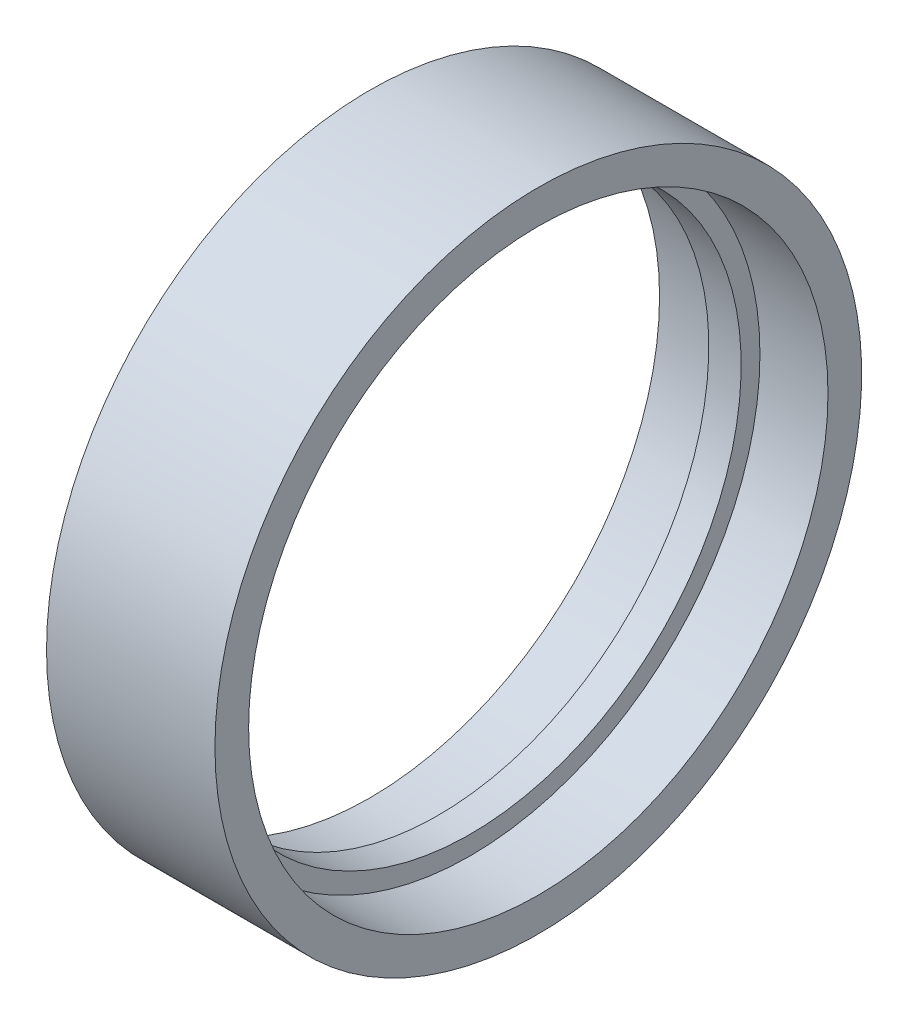
ISO-10303-21;
HEADER;
FILE_DESCRIPTION(('STEP AP214'),'2;1');
FILE_NAME('part.step','',(''),(''),'','','');
FILE_SCHEMA(('AUTOMOTIVE_DESIGN { 1 0 10303 214 1 1 1 1 }'));
ENDSEC;
DATA;
#1=APPLICATION_CONTEXT('core data for automotive mechanical design processes');
#2=APPLICATION_PROTOCOL_DEFINITION('international standard','automotive_design',2000,#1);
#3=PRODUCT_CONTEXT('',#1,'mechanical');
#4=PRODUCT('Part','Part','',(#3));
#5=PRODUCT_RELATED_PRODUCT_CATEGORY('part','',(#4));
#6=PRODUCT_DEFINITION_FORMATION('','',#4);
#7=PRODUCT_DEFINITION_CONTEXT('part definition',#1,'design');
#8=PRODUCT_DEFINITION('design','',#6,#7);
#9=PRODUCT_DEFINITION_SHAPE('','',#8);
#10=(LENGTH_UNIT() NAMED_UNIT(*) SI_UNIT(.MILLI.,.METRE.));
#11=(NAMED_UNIT(*) PLANE_ANGLE_UNIT() SI_UNIT($,.RADIAN.));
#12=(NAMED_UNIT(*) SI_UNIT($,.STERADIAN.) SOLID_ANGLE_UNIT());
#13=UNCERTAINTY_MEASURE_WITH_UNIT(LENGTH_MEASURE(1.E-05),#10,'distance_accuracy_value','');
#14=(GEOMETRIC_REPRESENTATION_CONTEXT(3) GLOBAL_UNCERTAINTY_ASSIGNED_CONTEXT((#13)) GLOBAL_UNIT_ASSIGNED_CONTEXT((#10,
#11,#12)) REPRESENTATION_CONTEXT('',''));
#15=CARTESIAN_POINT('',(0.,0.,0.));
#16=DIRECTION('',(0.,0.,1.));
#17=DIRECTION('',(1.,0.,0.));
#18=AXIS2_PLACEMENT_3D('',#15,#16,#17);
#19=CARTESIAN_POINT('',(-12.5,48.,0.));
#20=DIRECTION('',(1.,0.,0.));
#21=DIRECTION('',(0.,0.,-1.));
#22=AXIS2_PLACEMENT_3D('',#19,#20,#21);
#23=PLANE('',#22);
#24=CARTESIAN_POINT('',(-12.5,0.,0.));
#25=DIRECTION('',(-1.,0.,0.));
#26=DIRECTION('',(0.,0.,1.));
#27=AXIS2_PLACEMENT_3D('',#24,#25,#26);
#28=CIRCLE('',#27,43.);
#29=CARTESIAN_POINT('',(-12.5,0.,43.));
#30=VERTEX_POINT('',#29);
#31=EDGE_CURVE('E10',#30,#30,#28,.T.);
#32=ORIENTED_EDGE('',*,*,#31,.F.);
#33=EDGE_LOOP('',(#32));
#34=FACE_BOUND('',#33,.T.);
#35=CARTESIAN_POINT('',(-12.5,0.,0.));
#36=DIRECTION('',(-1.,0.,0.));
#37=DIRECTION('',(0.,0.,1.));
#38=AXIS2_PLACEMENT_3D('',#35,#36,#37);
#39=CIRCLE('',#38,48.);
#40=CARTESIAN_POINT('',(-12.5,0.,48.));
#41=VERTEX_POINT('',#40);
#42=EDGE_CURVE('E72',#41,#41,#39,.T.);
#43=ORIENTED_EDGE('',*,*,#42,.T.);
#44=EDGE_LOOP('',(#43));
#45=FACE_BOUND('',#44,.T.);
#46=ADVANCED_FACE('F37',(#34,#45),#23,.F.);
#47=CARTESIAN_POINT('',(-14.8858529111338,0.,0.));
#48=DIRECTION('',(-1.,0.,0.));
#49=DIRECTION('',(0.,0.,1.));
#50=AXIS2_PLACEMENT_3D('',#47,#48,#49);
#51=CYLINDRICAL_SURFACE('',#50,43.);
#52=CARTESIAN_POINT('',(-2.40221842481478,0.,0.));
#53=DIRECTION('',(-1.,0.,0.));
#54=DIRECTION('',(0.,0.,1.));
#55=AXIS2_PLACEMENT_3D('',#52,#53,#54);
#56=CIRCLE('',#55,43.);
#57=CARTESIAN_POINT('',(-2.40221842481478,0.,43.));
#58=VERTEX_POINT('',#57);
#59=EDGE_CURVE('E44',#58,#58,#56,.T.);
#60=ORIENTED_EDGE('',*,*,#59,.F.);
#61=EDGE_LOOP('',(#60));
#62=FACE_BOUND('',#61,.T.);
#63=ORIENTED_EDGE('',*,*,#31,.T.);
#64=EDGE_LOOP('',(#63));
#65=FACE_BOUND('',#64,.T.);
#66=ADVANCED_FACE('F110',(#62,#65),#51,.F.);
#67=CARTESIAN_POINT('',(-2.40221842481478,43.,0.));
#68=DIRECTION('',(1.,0.,0.));
#69=DIRECTION('',(0.,0.,-1.));
#70=AXIS2_PLACEMENT_3D('',#67,#68,#69);
#71=PLANE('',#70);
#72=CARTESIAN_POINT('',(-2.40221842481478,0.,0.));
#73=DIRECTION('',(-1.,0.,0.));
#74=DIRECTION('',(0.,0.,1.));
#75=AXIS2_PLACEMENT_3D('',#72,#73,#74);
#76=CIRCLE('',#75,40.2134744450181);
#77=CARTESIAN_POINT('',(-2.40221842481478,0.,40.2134744450181));
#78=VERTEX_POINT('',#77);
#79=EDGE_CURVE('E49',#78,#78,#76,.T.);
#80=ORIENTED_EDGE('',*,*,#79,.F.);
#81=EDGE_LOOP('',(#80));
#82=FACE_BOUND('',#81,.T.);
#83=ORIENTED_EDGE('',*,*,#59,.T.);
#84=EDGE_LOOP('',(#83));
#85=FACE_BOUND('',#84,.T.);
#86=ADVANCED_FACE('F105',(#82,#85),#71,.F.);
#87=CARTESIAN_POINT('',(-14.8858529111338,0.,0.));
#88=DIRECTION('',(-1.,0.,0.));
#89=DIRECTION('',(0.,0.,1.));
#90=AXIS2_PLACEMENT_3D('',#87,#88,#89);
#91=CYLINDRICAL_SURFACE('',#90,40.2134744450181);
#92=CARTESIAN_POINT('',(2.40221842481478,0.,0.));
#93=DIRECTION('',(-1.,0.,0.));
#94=DIRECTION('',(0.,0.,1.));
#95=AXIS2_PLACEMENT_3D('',#92,#93,#94);
#96=CIRCLE('',#95,40.2134744450181);
#97=CARTESIAN_POINT('',(2.40221842481478,0.,40.2134744450181));
#98=VERTEX_POINT('',#97);
#99=EDGE_CURVE('E54',#98,#98,#96,.T.);
#100=ORIENTED_EDGE('',*,*,#99,.F.);
#101=EDGE_LOOP('',(#100));
#102=FACE_BOUND('',#101,.T.);
#103=ORIENTED_EDGE('',*,*,#79,.T.);
#104=EDGE_LOOP('',(#103));
#105=FACE_BOUND('',#104,.T.);
#106=ADVANCED_FACE('F99',(#102,#105),#91,.F.);
#107=CARTESIAN_POINT('',(2.40221842481478,43.,0.));
#108=DIRECTION('',(-1.,0.,0.));
#109=DIRECTION('',(0.,0.,1.));
#110=AXIS2_PLACEMENT_3D('',#107,#108,#109);
#111=PLANE('',#110);
#112=CARTESIAN_POINT('',(2.40221842481478,0.,0.));
#113=DIRECTION('',(-1.,0.,0.));
#114=DIRECTION('',(0.,0.,1.));
#115=AXIS2_PLACEMENT_3D('',#112,#113,#114);
#116=CIRCLE('',#115,43.);
#117=CARTESIAN_POINT('',(2.40221842481478,0.,43.));
#118=VERTEX_POINT('',#117);
#119=EDGE_CURVE('E60',#118,#118,#116,.T.);
#120=ORIENTED_EDGE('',*,*,#119,.F.);
#121=EDGE_LOOP('',(#120));
#122=FACE_BOUND('',#121,.T.);
#123=ORIENTED_EDGE('',*,*,#99,.T.);
#124=EDGE_LOOP('',(#123));
#125=FACE_BOUND('',#124,.T.);
#126=ADVANCED_FACE('F93',(#122,#125),#111,.F.);
#127=CARTESIAN_POINT('',(-14.8858529111338,0.,0.));
#128=DIRECTION('',(-1.,0.,0.));
#129=DIRECTION('',(0.,0.,1.));
#130=AXIS2_PLACEMENT_3D('',#127,#128,#129);
#131=CYLINDRICAL_SURFACE('',#130,43.);
#132=CARTESIAN_POINT('',(12.5,0.,0.));
#133=DIRECTION('',(-1.,0.,0.));
#134=DIRECTION('',(0.,0.,1.));
#135=AXIS2_PLACEMENT_3D('',#132,#133,#134);
#136=CIRCLE('',#135,43.);
#137=CARTESIAN_POINT('',(12.5,0.,43.));
#138=VERTEX_POINT('',#137);
#139=EDGE_CURVE('E64',#138,#138,#136,.T.);
#140=ORIENTED_EDGE('',*,*,#139,.F.);
#141=EDGE_LOOP('',(#140));
#142=FACE_BOUND('',#141,.T.);
#143=ORIENTED_EDGE('',*,*,#119,.T.);
#144=EDGE_LOOP('',(#143));
#145=FACE_BOUND('',#144,.T.);
#146=ADVANCED_FACE('F87',(#142,#145),#131,.F.);
#147=CARTESIAN_POINT('',(12.5,48.,0.));
#148=DIRECTION('',(-1.,0.,0.));
#149=DIRECTION('',(0.,0.,1.));
#150=AXIS2_PLACEMENT_3D('',#147,#148,#149);
#151=PLANE('',#150);
#152=CARTESIAN_POINT('',(12.5,0.,0.));
#153=DIRECTION('',(-1.,0.,0.));
#154=DIRECTION('',(0.,0.,1.));
#155=AXIS2_PLACEMENT_3D('',#152,#153,#154);
#156=CIRCLE('',#155,48.);
#157=CARTESIAN_POINT('',(12.5,0.,48.));
#158=VERTEX_POINT('',#157);
#159=EDGE_CURVE('E68',#158,#158,#156,.T.);
#160=ORIENTED_EDGE('',*,*,#159,.F.);
#161=EDGE_LOOP('',(#160));
#162=FACE_BOUND('',#161,.T.);
#163=ORIENTED_EDGE('',*,*,#139,.T.);
#164=EDGE_LOOP('',(#163));
#165=FACE_BOUND('',#164,.T.);
#166=ADVANCED_FACE('F81',(#162,#165),#151,.F.);
#167=CARTESIAN_POINT('',(-14.8858529111338,0.,0.));
#168=DIRECTION('',(-1.,0.,0.));
#169=DIRECTION('',(0.,0.,1.));
#170=AXIS2_PLACEMENT_3D('',#167,#168,#169);
#171=CYLINDRICAL_SURFACE('',#170,48.);
#172=ORIENTED_EDGE('',*,*,#42,.F.);
#173=EDGE_LOOP('',(#172));
#174=FACE_BOUND('',#173,.T.);
#175=ORIENTED_EDGE('',*,*,#159,.T.);
#176=EDGE_LOOP('',(#175));
#177=FACE_BOUND('',#176,.T.);
#178=ADVANCED_FACE('F78',(#174,#177),#171,.T.);
#179=CLOSED_SHELL('',(#46,#66,#86,#106,#126,#146,#166,#178));
#180=MANIFOLD_SOLID_BREP('B2',#179);
#181=ADVANCED_BREP_SHAPE_REPRESENTATION('',(#18,#180),#14);
#182=SHAPE_DEFINITION_REPRESENTATION(#9,#181);
ENDSEC;
END-ISO-10303-21;
